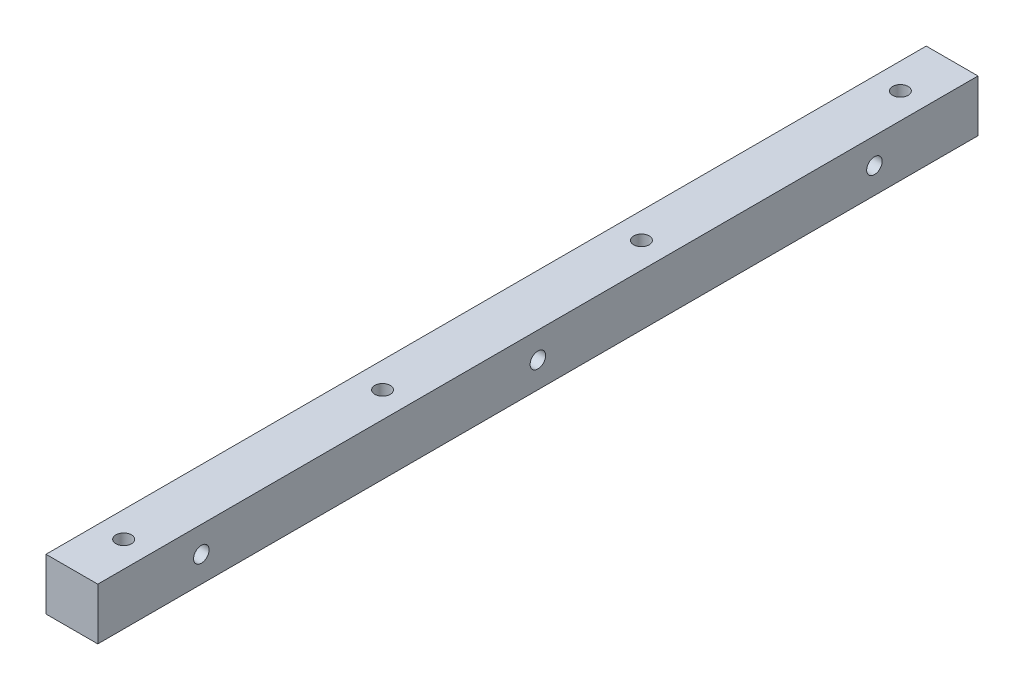
ISO-10303-21;
HEADER;
FILE_DESCRIPTION(('STEP AP214'),'2;1');
FILE_NAME('part.step','',(''),(''),'','','');
FILE_SCHEMA(('AUTOMOTIVE_DESIGN { 1 0 10303 214 1 1 1 1 }'));
ENDSEC;
DATA;
#1=APPLICATION_CONTEXT('core data for automotive mechanical design processes');
#2=APPLICATION_PROTOCOL_DEFINITION('international standard','automotive_design',2000,#1);
#3=PRODUCT_CONTEXT('',#1,'mechanical');
#4=PRODUCT('Part','Part','',(#3));
#5=PRODUCT_RELATED_PRODUCT_CATEGORY('part','',(#4));
#6=PRODUCT_DEFINITION_FORMATION('','',#4);
#7=PRODUCT_DEFINITION_CONTEXT('part definition',#1,'design');
#8=PRODUCT_DEFINITION('design','',#6,#7);
#9=PRODUCT_DEFINITION_SHAPE('','',#8);
#10=(LENGTH_UNIT() NAMED_UNIT(*) SI_UNIT(.MILLI.,.METRE.));
#11=(NAMED_UNIT(*) PLANE_ANGLE_UNIT() SI_UNIT($,.RADIAN.));
#12=(NAMED_UNIT(*) SI_UNIT($,.STERADIAN.) SOLID_ANGLE_UNIT());
#13=UNCERTAINTY_MEASURE_WITH_UNIT(LENGTH_MEASURE(1.E-05),#10,'distance_accuracy_value','');
#14=(GEOMETRIC_REPRESENTATION_CONTEXT(3) GLOBAL_UNCERTAINTY_ASSIGNED_CONTEXT((#13)) GLOBAL_UNIT_ASSIGNED_CONTEXT((#10,
#11,#12)) REPRESENTATION_CONTEXT('',''));
#15=CARTESIAN_POINT('',(0.,0.,0.));
#16=DIRECTION('',(0.,0.,1.));
#17=DIRECTION('',(1.,0.,0.));
#18=AXIS2_PLACEMENT_3D('',#15,#16,#17);
#19=CARTESIAN_POINT('',(0.,0.,170.));
#20=DIRECTION('',(1.,0.,0.));
#21=DIRECTION('',(0.,0.,-1.));
#22=AXIS2_PLACEMENT_3D('',#19,#20,#21);
#23=PLANE('',#22);
#24=CARTESIAN_POINT('',(0.,5.,150.));
#25=DIRECTION('',(-1.,0.,0.));
#26=DIRECTION('',(0.,0.,1.));
#27=AXIS2_PLACEMENT_3D('',#24,#25,#26);
#28=CIRCLE('',#27,1.5);
#29=CARTESIAN_POINT('',(0.,5.,151.5));
#30=VERTEX_POINT('',#29);
#31=EDGE_CURVE('E225',#30,#30,#28,.T.);
#32=ORIENTED_EDGE('',*,*,#31,.F.);
#33=EDGE_LOOP('',(#32));
#34=FACE_BOUND('',#33,.T.);
#35=CARTESIAN_POINT('',(0.,5.,85.));
#36=DIRECTION('',(-1.,0.,0.));
#37=DIRECTION('',(0.,0.,1.));
#38=AXIS2_PLACEMENT_3D('',#35,#36,#37);
#39=CIRCLE('',#38,1.5);
#40=CARTESIAN_POINT('',(0.,5.,86.5));
#41=VERTEX_POINT('',#40);
#42=EDGE_CURVE('E227',#41,#41,#39,.T.);
#43=ORIENTED_EDGE('',*,*,#42,.F.);
#44=EDGE_LOOP('',(#43));
#45=FACE_BOUND('',#44,.T.);
#46=CARTESIAN_POINT('',(0.,5.,20.));
#47=DIRECTION('',(-1.,0.,0.));
#48=DIRECTION('',(0.,0.,1.));
#49=AXIS2_PLACEMENT_3D('',#46,#47,#48);
#50=CIRCLE('',#49,1.5);
#51=CARTESIAN_POINT('',(0.,5.,21.5));
#52=VERTEX_POINT('',#51);
#53=EDGE_CURVE('E235',#52,#52,#50,.T.);
#54=ORIENTED_EDGE('',*,*,#53,.F.);
#55=EDGE_LOOP('',(#54));
#56=FACE_BOUND('',#55,.T.);
#57=DIRECTION('',(0.,-1.,0.));
#58=VECTOR('',#57,1.);
#59=CARTESIAN_POINT('',(0.,0.,0.));
#60=LINE('',#59,#58);
#61=CARTESIAN_POINT('',(0.,10.,0.));
#62=VERTEX_POINT('',#61);
#63=CARTESIAN_POINT('',(0.,0.,0.));
#64=VERTEX_POINT('',#63);
#65=EDGE_CURVE('E73',#62,#64,#60,.T.);
#66=ORIENTED_EDGE('',*,*,#65,.T.);
#67=DIRECTION('',(0.,0.,-1.));
#68=VECTOR('',#67,1.);
#69=CARTESIAN_POINT('',(0.,0.,170.));
#70=LINE('',#69,#68);
#71=CARTESIAN_POINT('',(0.,0.,170.));
#72=VERTEX_POINT('',#71);
#73=EDGE_CURVE('E80',#72,#64,#70,.T.);
#74=ORIENTED_EDGE('',*,*,#73,.F.);
#75=DIRECTION('',(0.,-1.,0.));
#76=VECTOR('',#75,1.);
#77=CARTESIAN_POINT('',(0.,0.,170.));
#78=LINE('',#77,#76);
#79=CARTESIAN_POINT('',(0.,10.,170.));
#80=VERTEX_POINT('',#79);
#81=EDGE_CURVE('E101',#80,#72,#78,.T.);
#82=ORIENTED_EDGE('',*,*,#81,.F.);
#83=DIRECTION('',(0.,0.,-1.));
#84=VECTOR('',#83,1.);
#85=CARTESIAN_POINT('',(0.,10.,170.));
#86=LINE('',#85,#84);
#87=EDGE_CURVE('E90',#80,#62,#86,.T.);
#88=ORIENTED_EDGE('',*,*,#87,.T.);
#89=EDGE_LOOP('',(#66,#74,#82,#88));
#90=FACE_BOUND('',#89,.T.);
#91=ADVANCED_FACE('F27',(#34,#45,#56,#90),#23,.F.);
#92=CARTESIAN_POINT('',(0.,0.,170.));
#93=DIRECTION('',(0.,1.,0.));
#94=DIRECTION('',(0.,0.,1.));
#95=AXIS2_PLACEMENT_3D('',#92,#93,#94);
#96=PLANE('',#95);
#97=CARTESIAN_POINT('',(5.,0.,60.));
#98=DIRECTION('',(0.,1.,0.));
#99=DIRECTION('',(0.,0.,1.));
#100=AXIS2_PLACEMENT_3D('',#97,#98,#99);
#101=CIRCLE('',#100,1.5);
#102=CARTESIAN_POINT('',(5.,0.,61.5));
#103=VERTEX_POINT('',#102);
#104=EDGE_CURVE('E241',#103,#103,#101,.T.);
#105=ORIENTED_EDGE('',*,*,#104,.T.);
#106=EDGE_LOOP('',(#105));
#107=FACE_BOUND('',#106,.T.);
#108=CARTESIAN_POINT('',(5.,0.,10.));
#109=DIRECTION('',(0.,1.,0.));
#110=DIRECTION('',(0.,0.,1.));
#111=AXIS2_PLACEMENT_3D('',#108,#109,#110);
#112=CIRCLE('',#111,1.5);
#113=CARTESIAN_POINT('',(5.,0.,11.5));
#114=VERTEX_POINT('',#113);
#115=EDGE_CURVE('E91',#114,#114,#112,.T.);
#116=ORIENTED_EDGE('',*,*,#115,.T.);
#117=EDGE_LOOP('',(#116));
#118=FACE_BOUND('',#117,.T.);
#119=DIRECTION('',(1.,0.,0.));
#120=VECTOR('',#119,1.);
#121=CARTESIAN_POINT('',(0.,0.,0.));
#122=LINE('',#121,#120);
#123=CARTESIAN_POINT('',(10.,0.,0.));
#124=VERTEX_POINT('',#123);
#125=EDGE_CURVE('E68',#64,#124,#122,.T.);
#126=ORIENTED_EDGE('',*,*,#125,.T.);
#127=DIRECTION('',(0.,0.,-1.));
#128=VECTOR('',#127,1.);
#129=CARTESIAN_POINT('',(10.,0.,170.));
#130=LINE('',#129,#128);
#131=CARTESIAN_POINT('',(10.,0.,170.));
#132=VERTEX_POINT('',#131);
#133=EDGE_CURVE('E87',#132,#124,#130,.T.);
#134=ORIENTED_EDGE('',*,*,#133,.F.);
#135=DIRECTION('',(1.,0.,0.));
#136=VECTOR('',#135,1.);
#137=CARTESIAN_POINT('',(0.,0.,170.));
#138=LINE('',#137,#136);
#139=EDGE_CURVE('E83',#72,#132,#138,.T.);
#140=ORIENTED_EDGE('',*,*,#139,.F.);
#141=ORIENTED_EDGE('',*,*,#73,.T.);
#142=EDGE_LOOP('',(#126,#134,#140,#141));
#143=FACE_BOUND('',#142,.T.);
#144=CARTESIAN_POINT('',(5.,0.,110.));
#145=DIRECTION('',(0.,1.,0.));
#146=DIRECTION('',(0.,0.,1.));
#147=AXIS2_PLACEMENT_3D('',#144,#145,#146);
#148=CIRCLE('',#147,1.5);
#149=CARTESIAN_POINT('',(5.,0.,111.5));
#150=VERTEX_POINT('',#149);
#151=EDGE_CURVE('E86',#150,#150,#148,.T.);
#152=ORIENTED_EDGE('',*,*,#151,.T.);
#153=EDGE_LOOP('',(#152));
#154=FACE_BOUND('',#153,.T.);
#155=CARTESIAN_POINT('',(5.,0.,160.));
#156=DIRECTION('',(0.,1.,0.));
#157=DIRECTION('',(0.,0.,1.));
#158=AXIS2_PLACEMENT_3D('',#155,#156,#157);
#159=CIRCLE('',#158,1.5);
#160=CARTESIAN_POINT('',(5.,0.,161.5));
#161=VERTEX_POINT('',#160);
#162=EDGE_CURVE('E35',#161,#161,#159,.T.);
#163=ORIENTED_EDGE('',*,*,#162,.T.);
#164=EDGE_LOOP('',(#163));
#165=FACE_BOUND('',#164,.T.);
#166=ADVANCED_FACE('F81',(#107,#118,#143,#154,#165),#96,.F.);
#167=CARTESIAN_POINT('',(10.,0.,170.));
#168=DIRECTION('',(-1.,0.,0.));
#169=DIRECTION('',(0.,-1.,0.));
#170=AXIS2_PLACEMENT_3D('',#167,#168,#169);
#171=PLANE('',#170);
#172=CARTESIAN_POINT('',(10.,5.,150.));
#173=DIRECTION('',(-1.,0.,0.));
#174=DIRECTION('',(0.,0.,1.));
#175=AXIS2_PLACEMENT_3D('',#172,#173,#174);
#176=CIRCLE('',#175,1.5);
#177=CARTESIAN_POINT('',(10.,5.,151.5));
#178=VERTEX_POINT('',#177);
#179=EDGE_CURVE('E223',#178,#178,#176,.T.);
#180=ORIENTED_EDGE('',*,*,#179,.T.);
#181=EDGE_LOOP('',(#180));
#182=FACE_BOUND('',#181,.T.);
#183=CARTESIAN_POINT('',(10.,5.,85.));
#184=DIRECTION('',(-1.,0.,0.));
#185=DIRECTION('',(0.,0.,1.));
#186=AXIS2_PLACEMENT_3D('',#183,#184,#185);
#187=CIRCLE('',#186,1.5);
#188=CARTESIAN_POINT('',(10.,5.,86.5));
#189=VERTEX_POINT('',#188);
#190=EDGE_CURVE('E232',#189,#189,#187,.T.);
#191=ORIENTED_EDGE('',*,*,#190,.T.);
#192=EDGE_LOOP('',(#191));
#193=FACE_BOUND('',#192,.T.);
#194=CARTESIAN_POINT('',(10.,5.,20.));
#195=DIRECTION('',(-1.,0.,0.));
#196=DIRECTION('',(0.,0.,1.));
#197=AXIS2_PLACEMENT_3D('',#194,#195,#196);
#198=CIRCLE('',#197,1.5);
#199=CARTESIAN_POINT('',(10.,5.,21.5));
#200=VERTEX_POINT('',#199);
#201=EDGE_CURVE('E238',#200,#200,#198,.T.);
#202=ORIENTED_EDGE('',*,*,#201,.T.);
#203=EDGE_LOOP('',(#202));
#204=FACE_BOUND('',#203,.T.);
#205=DIRECTION('',(0.,1.,0.));
#206=VECTOR('',#205,1.);
#207=CARTESIAN_POINT('',(10.,0.,0.));
#208=LINE('',#207,#206);
#209=CARTESIAN_POINT('',(10.,10.,0.));
#210=VERTEX_POINT('',#209);
#211=EDGE_CURVE('E74',#124,#210,#208,.T.);
#212=ORIENTED_EDGE('',*,*,#211,.T.);
#213=DIRECTION('',(0.,0.,-1.));
#214=VECTOR('',#213,1.);
#215=CARTESIAN_POINT('',(10.,10.,170.));
#216=LINE('',#215,#214);
#217=CARTESIAN_POINT('',(10.,10.,170.));
#218=VERTEX_POINT('',#217);
#219=EDGE_CURVE('E107',#218,#210,#216,.T.);
#220=ORIENTED_EDGE('',*,*,#219,.F.);
#221=DIRECTION('',(0.,1.,0.));
#222=VECTOR('',#221,1.);
#223=CARTESIAN_POINT('',(10.,0.,170.));
#224=LINE('',#223,#222);
#225=EDGE_CURVE('E47',#132,#218,#224,.T.);
#226=ORIENTED_EDGE('',*,*,#225,.F.);
#227=ORIENTED_EDGE('',*,*,#133,.T.);
#228=EDGE_LOOP('',(#212,#220,#226,#227));
#229=FACE_BOUND('',#228,.T.);
#230=ADVANCED_FACE('F128',(#182,#193,#204,#229),#171,.F.);
#231=CARTESIAN_POINT('',(0.,10.,170.));
#232=DIRECTION('',(0.,-1.,0.));
#233=DIRECTION('',(0.,0.,-1.));
#234=AXIS2_PLACEMENT_3D('',#231,#232,#233);
#235=PLANE('',#234);
#236=CARTESIAN_POINT('',(5.,10.,60.));
#237=DIRECTION('',(0.,1.,0.));
#238=DIRECTION('',(0.,0.,1.));
#239=AXIS2_PLACEMENT_3D('',#236,#237,#238);
#240=CIRCLE('',#239,1.5);
#241=CARTESIAN_POINT('',(5.,10.,61.5));
#242=VERTEX_POINT('',#241);
#243=EDGE_CURVE('E244',#242,#242,#240,.T.);
#244=ORIENTED_EDGE('',*,*,#243,.F.);
#245=EDGE_LOOP('',(#244));
#246=FACE_BOUND('',#245,.T.);
#247=CARTESIAN_POINT('',(5.,10.,10.));
#248=DIRECTION('',(0.,1.,0.));
#249=DIRECTION('',(0.,0.,1.));
#250=AXIS2_PLACEMENT_3D('',#247,#248,#249);
#251=CIRCLE('',#250,1.5);
#252=CARTESIAN_POINT('',(5.,10.,11.5));
#253=VERTEX_POINT('',#252);
#254=EDGE_CURVE('E94',#253,#253,#251,.T.);
#255=ORIENTED_EDGE('',*,*,#254,.F.);
#256=EDGE_LOOP('',(#255));
#257=FACE_BOUND('',#256,.T.);
#258=DIRECTION('',(-1.,0.,0.));
#259=VECTOR('',#258,1.);
#260=CARTESIAN_POINT('',(0.,10.,0.));
#261=LINE('',#260,#259);
#262=EDGE_CURVE('E99',#210,#62,#261,.T.);
#263=ORIENTED_EDGE('',*,*,#262,.T.);
#264=ORIENTED_EDGE('',*,*,#87,.F.);
#265=DIRECTION('',(-1.,0.,0.));
#266=VECTOR('',#265,1.);
#267=CARTESIAN_POINT('',(0.,10.,170.));
#268=LINE('',#267,#266);
#269=EDGE_CURVE('E42',#218,#80,#268,.T.);
#270=ORIENTED_EDGE('',*,*,#269,.F.);
#271=ORIENTED_EDGE('',*,*,#219,.T.);
#272=EDGE_LOOP('',(#263,#264,#270,#271));
#273=FACE_BOUND('',#272,.T.);
#274=CARTESIAN_POINT('',(5.,10.,110.));
#275=DIRECTION('',(0.,1.,0.));
#276=DIRECTION('',(0.,0.,1.));
#277=AXIS2_PLACEMENT_3D('',#274,#275,#276);
#278=CIRCLE('',#277,1.5);
#279=CARTESIAN_POINT('',(5.,10.,111.5));
#280=VERTEX_POINT('',#279);
#281=EDGE_CURVE('E113',#280,#280,#278,.T.);
#282=ORIENTED_EDGE('',*,*,#281,.F.);
#283=EDGE_LOOP('',(#282));
#284=FACE_BOUND('',#283,.T.);
#285=CARTESIAN_POINT('',(5.,10.,160.));
#286=DIRECTION('',(0.,1.,0.));
#287=DIRECTION('',(0.,0.,1.));
#288=AXIS2_PLACEMENT_3D('',#285,#286,#287);
#289=CIRCLE('',#288,1.5);
#290=CARTESIAN_POINT('',(5.,10.,161.5));
#291=VERTEX_POINT('',#290);
#292=EDGE_CURVE('E11',#291,#291,#289,.T.);
#293=ORIENTED_EDGE('',*,*,#292,.F.);
#294=EDGE_LOOP('',(#293));
#295=FACE_BOUND('',#294,.T.);
#296=ADVANCED_FACE('F125',(#246,#257,#273,#284,#295),#235,.F.);
#297=CARTESIAN_POINT('',(0.,10.,170.));
#298=DIRECTION('',(0.,0.,-1.));
#299=DIRECTION('',(-1.,0.,0.));
#300=AXIS2_PLACEMENT_3D('',#297,#298,#299);
#301=PLANE('',#300);
#302=ORIENTED_EDGE('',*,*,#81,.T.);
#303=ORIENTED_EDGE('',*,*,#139,.T.);
#304=ORIENTED_EDGE('',*,*,#225,.T.);
#305=ORIENTED_EDGE('',*,*,#269,.T.);
#306=EDGE_LOOP('',(#302,#303,#304,#305));
#307=FACE_BOUND('',#306,.T.);
#308=ADVANCED_FACE('F127',(#307),#301,.F.);
#309=CARTESIAN_POINT('',(0.,10.,0.));
#310=DIRECTION('',(0.,0.,-1.));
#311=DIRECTION('',(-1.,0.,0.));
#312=AXIS2_PLACEMENT_3D('',#309,#310,#311);
#313=PLANE('',#312);
#314=ORIENTED_EDGE('',*,*,#65,.F.);
#315=ORIENTED_EDGE('',*,*,#262,.F.);
#316=ORIENTED_EDGE('',*,*,#211,.F.);
#317=ORIENTED_EDGE('',*,*,#125,.F.);
#318=EDGE_LOOP('',(#314,#315,#316,#317));
#319=FACE_BOUND('',#318,.T.);
#320=ADVANCED_FACE('F70',(#319),#313,.T.);
#321=CARTESIAN_POINT('',(5.,0.,10.));
#322=DIRECTION('',(0.,1.,0.));
#323=DIRECTION('',(0.,0.,1.));
#324=AXIS2_PLACEMENT_3D('',#321,#322,#323);
#325=CYLINDRICAL_SURFACE('',#324,1.5);
#326=ORIENTED_EDGE('',*,*,#115,.F.);
#327=EDGE_LOOP('',(#326));
#328=FACE_BOUND('',#327,.T.);
#329=ORIENTED_EDGE('',*,*,#254,.T.);
#330=EDGE_LOOP('',(#329));
#331=FACE_BOUND('',#330,.T.);
#332=ADVANCED_FACE('F156',(#328,#331),#325,.F.);
#333=CARTESIAN_POINT('',(5.,0.,60.));
#334=DIRECTION('',(0.,1.,0.));
#335=DIRECTION('',(0.,0.,1.));
#336=AXIS2_PLACEMENT_3D('',#333,#334,#335);
#337=CYLINDRICAL_SURFACE('',#336,1.5);
#338=ORIENTED_EDGE('',*,*,#104,.F.);
#339=EDGE_LOOP('',(#338));
#340=FACE_BOUND('',#339,.T.);
#341=ORIENTED_EDGE('',*,*,#243,.T.);
#342=EDGE_LOOP('',(#341));
#343=FACE_BOUND('',#342,.T.);
#344=ADVANCED_FACE('F152',(#340,#343),#337,.F.);
#345=CARTESIAN_POINT('',(5.,0.,110.));
#346=DIRECTION('',(0.,1.,0.));
#347=DIRECTION('',(0.,0.,1.));
#348=AXIS2_PLACEMENT_3D('',#345,#346,#347);
#349=CYLINDRICAL_SURFACE('',#348,1.5);
#350=ORIENTED_EDGE('',*,*,#151,.F.);
#351=EDGE_LOOP('',(#350));
#352=FACE_BOUND('',#351,.T.);
#353=ORIENTED_EDGE('',*,*,#281,.T.);
#354=EDGE_LOOP('',(#353));
#355=FACE_BOUND('',#354,.T.);
#356=ADVANCED_FACE('F122',(#352,#355),#349,.F.);
#357=CARTESIAN_POINT('',(5.,0.,160.));
#358=DIRECTION('',(0.,1.,0.));
#359=DIRECTION('',(0.,0.,1.));
#360=AXIS2_PLACEMENT_3D('',#357,#358,#359);
#361=CYLINDRICAL_SURFACE('',#360,1.5);
#362=ORIENTED_EDGE('',*,*,#162,.F.);
#363=EDGE_LOOP('',(#362));
#364=FACE_BOUND('',#363,.T.);
#365=ORIENTED_EDGE('',*,*,#292,.T.);
#366=EDGE_LOOP('',(#365));
#367=FACE_BOUND('',#366,.T.);
#368=ADVANCED_FACE('F29',(#364,#367),#361,.F.);
#369=CARTESIAN_POINT('',(10.,5.,20.));
#370=DIRECTION('',(-1.,0.,0.));
#371=DIRECTION('',(0.,0.,1.));
#372=AXIS2_PLACEMENT_3D('',#369,#370,#371);
#373=CYLINDRICAL_SURFACE('',#372,1.5);
#374=ORIENTED_EDGE('',*,*,#201,.F.);
#375=EDGE_LOOP('',(#374));
#376=FACE_BOUND('',#375,.T.);
#377=ORIENTED_EDGE('',*,*,#53,.T.);
#378=EDGE_LOOP('',(#377));
#379=FACE_BOUND('',#378,.T.);
#380=ADVANCED_FACE('F121',(#376,#379),#373,.F.);
#381=CARTESIAN_POINT('',(10.,5.,85.));
#382=DIRECTION('',(-1.,0.,0.));
#383=DIRECTION('',(0.,0.,1.));
#384=AXIS2_PLACEMENT_3D('',#381,#382,#383);
#385=CYLINDRICAL_SURFACE('',#384,1.5);
#386=ORIENTED_EDGE('',*,*,#190,.F.);
#387=EDGE_LOOP('',(#386));
#388=FACE_BOUND('',#387,.T.);
#389=ORIENTED_EDGE('',*,*,#42,.T.);
#390=EDGE_LOOP('',(#389));
#391=FACE_BOUND('',#390,.T.);
#392=ADVANCED_FACE('F202',(#388,#391),#385,.F.);
#393=CARTESIAN_POINT('',(10.,5.,150.));
#394=DIRECTION('',(-1.,0.,0.));
#395=DIRECTION('',(0.,0.,1.));
#396=AXIS2_PLACEMENT_3D('',#393,#394,#395);
#397=CYLINDRICAL_SURFACE('',#396,1.5);
#398=ORIENTED_EDGE('',*,*,#179,.F.);
#399=EDGE_LOOP('',(#398));
#400=FACE_BOUND('',#399,.T.);
#401=ORIENTED_EDGE('',*,*,#31,.T.);
#402=EDGE_LOOP('',(#401));
#403=FACE_BOUND('',#402,.T.);
#404=ADVANCED_FACE('F210',(#400,#403),#397,.F.);
#405=CLOSED_SHELL('',(#91,#166,#230,#296,#308,#320,#332,#344,#356,#368,#380,#392,#404));
#406=MANIFOLD_SOLID_BREP('B2',#405);
#407=ADVANCED_BREP_SHAPE_REPRESENTATION('',(#18,#406),#14);
#408=SHAPE_DEFINITION_REPRESENTATION(#9,#407);
ENDSEC;
END-ISO-10303-21;
